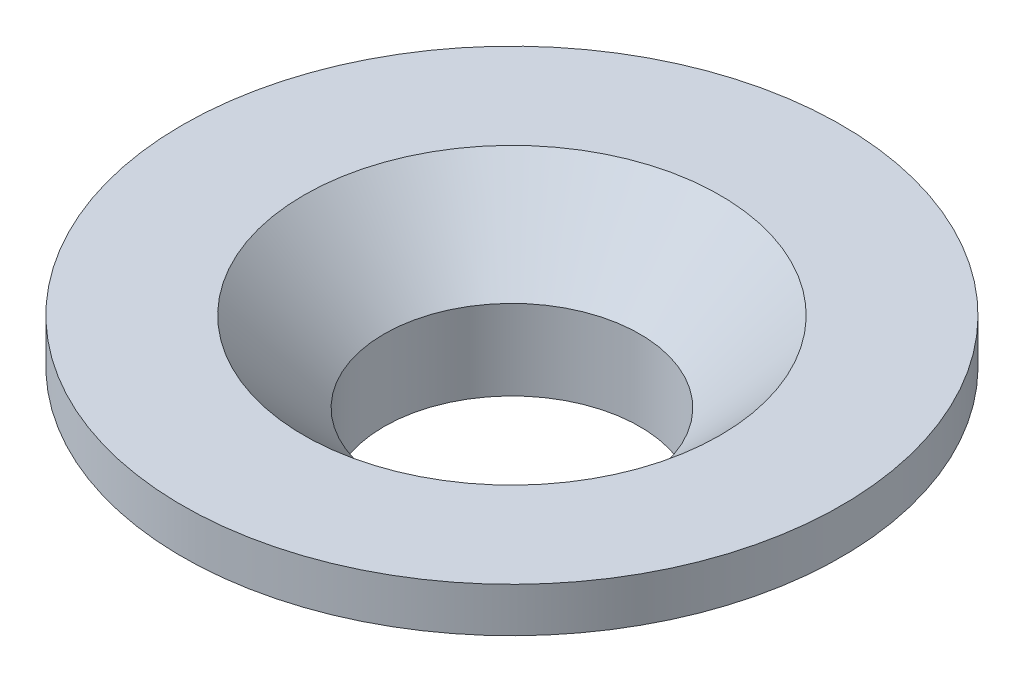
ISO-10303-21;
HEADER;
FILE_DESCRIPTION(('STEP AP214'),'2;1');
FILE_NAME('part.step','',(''),(''),'','','');
FILE_SCHEMA(('AUTOMOTIVE_DESIGN { 1 0 10303 214 1 1 1 1 }'));
ENDSEC;
DATA;
#1=APPLICATION_CONTEXT('core data for automotive mechanical design processes');
#2=APPLICATION_PROTOCOL_DEFINITION('international standard','automotive_design',2000,#1);
#3=PRODUCT_CONTEXT('',#1,'mechanical');
#4=PRODUCT('Part','Part','',(#3));
#5=PRODUCT_RELATED_PRODUCT_CATEGORY('part','',(#4));
#6=PRODUCT_DEFINITION_FORMATION('','',#4);
#7=PRODUCT_DEFINITION_CONTEXT('part definition',#1,'design');
#8=PRODUCT_DEFINITION('design','',#6,#7);
#9=PRODUCT_DEFINITION_SHAPE('','',#8);
#10=(LENGTH_UNIT() NAMED_UNIT(*) SI_UNIT(.MILLI.,.METRE.));
#11=(NAMED_UNIT(*) PLANE_ANGLE_UNIT() SI_UNIT($,.RADIAN.));
#12=(NAMED_UNIT(*) SI_UNIT($,.STERADIAN.) SOLID_ANGLE_UNIT());
#13=UNCERTAINTY_MEASURE_WITH_UNIT(LENGTH_MEASURE(1.E-05),#10,'distance_accuracy_value','');
#14=(GEOMETRIC_REPRESENTATION_CONTEXT(3) GLOBAL_UNCERTAINTY_ASSIGNED_CONTEXT((#13)) GLOBAL_UNIT_ASSIGNED_CONTEXT((#10,
#11,#12)) REPRESENTATION_CONTEXT('',''));
#15=CARTESIAN_POINT('',(0.,0.,0.));
#16=DIRECTION('',(0.,0.,1.));
#17=DIRECTION('',(1.,0.,0.));
#18=AXIS2_PLACEMENT_3D('',#15,#16,#17);
#19=CARTESIAN_POINT('',(-11.68,0.,0.));
#20=DIRECTION('',(0.,1.,0.));
#21=DIRECTION('',(-1.,0.,0.));
#22=AXIS2_PLACEMENT_3D('',#19,#20,#21);
#23=TOROIDAL_SURFACE('',#22,11.68,2.5);
#24=CARTESIAN_POINT('',(-11.68,0.,0.));
#25=DIRECTION('',(0.,1.,0.));
#26=DIRECTION('',(-1.,0.,0.));
#27=AXIS2_PLACEMENT_3D('',#24,#25,#26);
#28=CIRCLE('',#27,9.18);
#29=CARTESIAN_POINT('',(-20.86,0.,0.));
#30=VERTEX_POINT('',#29);
#31=EDGE_CURVE('E78',#30,#30,#28,.T.);
#32=ORIENTED_EDGE('',*,*,#31,.T.);
#33=EDGE_LOOP('',(#32));
#34=FACE_BOUND('',#33,.T.);
#35=CARTESIAN_POINT('',(-11.68,2.5,0.));
#36=DIRECTION('',(0.,1.,0.));
#37=DIRECTION('',(-1.,0.,0.));
#38=AXIS2_PLACEMENT_3D('',#35,#36,#37);
#39=CIRCLE('',#38,11.68);
#40=CARTESIAN_POINT('',(-23.36,2.5,0.));
#41=VERTEX_POINT('',#40);
#42=EDGE_CURVE('E10',#41,#41,#39,.T.);
#43=ORIENTED_EDGE('',*,*,#42,.F.);
#44=EDGE_LOOP('',(#43));
#45=FACE_BOUND('',#44,.T.);
#46=ADVANCED_FACE('F43',(#34,#45),#23,.F.);
#47=CARTESIAN_POINT('',(0.,2.5,0.));
#48=DIRECTION('',(0.,1.,0.));
#49=DIRECTION('',(-1.,0.,0.));
#50=AXIS2_PLACEMENT_3D('',#47,#48,#49);
#51=PLANE('',#50);
#52=CARTESIAN_POINT('',(-11.68,2.5,0.));
#53=DIRECTION('',(0.,1.,0.));
#54=DIRECTION('',(-1.,0.,0.));
#55=AXIS2_PLACEMENT_3D('',#52,#53,#54);
#56=CIRCLE('',#55,18.5);
#57=CARTESIAN_POINT('',(-30.18,2.49999999999999,0.));
#58=VERTEX_POINT('',#57);
#59=EDGE_CURVE('E50',#58,#58,#56,.T.);
#60=ORIENTED_EDGE('',*,*,#59,.F.);
#61=EDGE_LOOP('',(#60));
#62=FACE_BOUND('',#61,.T.);
#63=ORIENTED_EDGE('',*,*,#42,.T.);
#64=EDGE_LOOP('',(#63));
#65=FACE_BOUND('',#64,.T.);
#66=ADVANCED_FACE('F97',(#62,#65),#51,.F.);
#67=CARTESIAN_POINT('',(-11.68,6.13361587489452,0.));
#68=DIRECTION('',(0.,1.,0.));
#69=DIRECTION('',(-1.,0.,0.));
#70=AXIS2_PLACEMENT_3D('',#67,#68,#69);
#71=CYLINDRICAL_SURFACE('',#70,18.5);
#72=ORIENTED_EDGE('',*,*,#59,.T.);
#73=EDGE_LOOP('',(#72));
#74=FACE_BOUND('',#73,.T.);
#75=CARTESIAN_POINT('',(-11.68,5.,0.));
#76=DIRECTION('',(0.,1.,0.));
#77=DIRECTION('',(-1.,0.,0.));
#78=AXIS2_PLACEMENT_3D('',#75,#76,#77);
#79=CIRCLE('',#78,18.5);
#80=CARTESIAN_POINT('',(-30.18,4.99999999999999,0.));
#81=VERTEX_POINT('',#80);
#82=EDGE_CURVE('E55',#81,#81,#79,.T.);
#83=ORIENTED_EDGE('',*,*,#82,.F.);
#84=EDGE_LOOP('',(#83));
#85=FACE_BOUND('',#84,.T.);
#86=ADVANCED_FACE('F101',(#74,#85),#71,.T.);
#87=CARTESIAN_POINT('',(0.,5.,0.));
#88=DIRECTION('',(0.,1.,0.));
#89=DIRECTION('',(-1.,0.,0.));
#90=AXIS2_PLACEMENT_3D('',#87,#88,#89);
#91=PLANE('',#90);
#92=ORIENTED_EDGE('',*,*,#82,.T.);
#93=EDGE_LOOP('',(#92));
#94=FACE_BOUND('',#93,.T.);
#95=CARTESIAN_POINT('',(-11.68,5.,0.));
#96=DIRECTION('',(0.,1.,0.));
#97=DIRECTION('',(-1.,0.,0.));
#98=AXIS2_PLACEMENT_3D('',#95,#96,#97);
#99=CIRCLE('',#98,11.68);
#100=CARTESIAN_POINT('',(-23.36,5.,0.));
#101=VERTEX_POINT('',#100);
#102=EDGE_CURVE('E60',#101,#101,#99,.T.);
#103=ORIENTED_EDGE('',*,*,#102,.F.);
#104=EDGE_LOOP('',(#103));
#105=FACE_BOUND('',#104,.T.);
#106=ADVANCED_FACE('F106',(#94,#105),#91,.T.);
#107=CARTESIAN_POINT('',(-11.68,5.,0.));
#108=DIRECTION('',(0.,1.,0.));
#109=DIRECTION('',(-1.,0.,0.));
#110=AXIS2_PLACEMENT_3D('',#107,#108,#109);
#111=CONICAL_SURFACE('',#110,11.68,0.785398163397454);
#112=CARTESIAN_POINT('',(-11.68,0.500000000000041,0.));
#113=DIRECTION('',(0.,1.,0.));
#114=DIRECTION('',(-1.,0.,0.));
#115=AXIS2_PLACEMENT_3D('',#112,#113,#114);
#116=CIRCLE('',#115,7.18);
#117=CARTESIAN_POINT('',(-18.86,0.50000000000004,0.));
#118=VERTEX_POINT('',#117);
#119=EDGE_CURVE('E66',#118,#118,#116,.T.);
#120=ORIENTED_EDGE('',*,*,#119,.F.);
#121=EDGE_LOOP('',(#120));
#122=FACE_BOUND('',#121,.T.);
#123=ORIENTED_EDGE('',*,*,#102,.T.);
#124=EDGE_LOOP('',(#123));
#125=FACE_BOUND('',#124,.T.);
#126=ADVANCED_FACE('F111',(#122,#125),#111,.F.);
#127=CARTESIAN_POINT('',(-11.68,6.13361587489452,0.));
#128=DIRECTION('',(0.,1.,0.));
#129=DIRECTION('',(-1.,0.,0.));
#130=AXIS2_PLACEMENT_3D('',#127,#128,#129);
#131=CYLINDRICAL_SURFACE('',#130,7.18);
#132=CARTESIAN_POINT('',(-11.68,-4.,0.));
#133=DIRECTION('',(0.,1.,0.));
#134=DIRECTION('',(-1.,0.,0.));
#135=AXIS2_PLACEMENT_3D('',#132,#133,#134);
#136=CIRCLE('',#135,7.18);
#137=CARTESIAN_POINT('',(-18.86,-4.,0.));
#138=VERTEX_POINT('',#137);
#139=EDGE_CURVE('E70',#138,#138,#136,.T.);
#140=ORIENTED_EDGE('',*,*,#139,.F.);
#141=EDGE_LOOP('',(#140));
#142=FACE_BOUND('',#141,.T.);
#143=ORIENTED_EDGE('',*,*,#119,.T.);
#144=EDGE_LOOP('',(#143));
#145=FACE_BOUND('',#144,.T.);
#146=ADVANCED_FACE('F93',(#142,#145),#131,.F.);
#147=CARTESIAN_POINT('',(0.,-4.,0.));
#148=DIRECTION('',(0.,1.,0.));
#149=DIRECTION('',(-1.,0.,0.));
#150=AXIS2_PLACEMENT_3D('',#147,#148,#149);
#151=PLANE('',#150);
#152=CARTESIAN_POINT('',(-11.68,-4.,0.));
#153=DIRECTION('',(0.,1.,0.));
#154=DIRECTION('',(-1.,0.,0.));
#155=AXIS2_PLACEMENT_3D('',#152,#153,#154);
#156=CIRCLE('',#155,9.18);
#157=CARTESIAN_POINT('',(-20.86,-4.,0.));
#158=VERTEX_POINT('',#157);
#159=EDGE_CURVE('E74',#158,#158,#156,.T.);
#160=ORIENTED_EDGE('',*,*,#159,.F.);
#161=EDGE_LOOP('',(#160));
#162=FACE_BOUND('',#161,.T.);
#163=ORIENTED_EDGE('',*,*,#139,.T.);
#164=EDGE_LOOP('',(#163));
#165=FACE_BOUND('',#164,.T.);
#166=ADVANCED_FACE('F87',(#162,#165),#151,.F.);
#167=CARTESIAN_POINT('',(-11.68,6.13361587489452,0.));
#168=DIRECTION('',(0.,1.,0.));
#169=DIRECTION('',(-1.,0.,0.));
#170=AXIS2_PLACEMENT_3D('',#167,#168,#169);
#171=CYLINDRICAL_SURFACE('',#170,9.18);
#172=ORIENTED_EDGE('',*,*,#159,.T.);
#173=EDGE_LOOP('',(#172));
#174=FACE_BOUND('',#173,.T.);
#175=ORIENTED_EDGE('',*,*,#31,.F.);
#176=EDGE_LOOP('',(#175));
#177=FACE_BOUND('',#176,.T.);
#178=ADVANCED_FACE('F85',(#174,#177),#171,.T.);
#179=CLOSED_SHELL('',(#46,#66,#86,#106,#126,#146,#166,#178));
#180=MANIFOLD_SOLID_BREP('B2',#179);
#181=ADVANCED_BREP_SHAPE_REPRESENTATION('',(#18,#180),#14);
#182=SHAPE_DEFINITION_REPRESENTATION(#9,#181);
ENDSEC;
END-ISO-10303-21;
